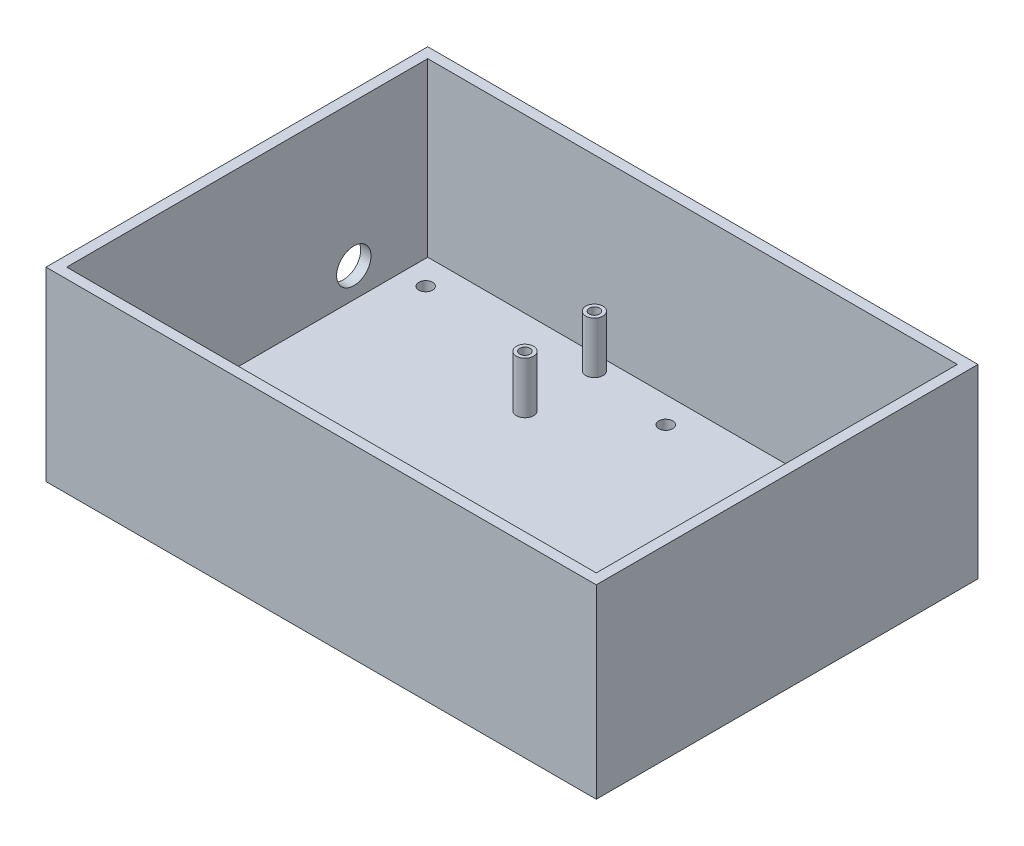
ISO-10303-21;
HEADER;
FILE_DESCRIPTION(('STEP AP214'),'2;1');
FILE_NAME('part.step','',(''),(''),'','','');
FILE_SCHEMA(('AUTOMOTIVE_DESIGN { 1 0 10303 214 1 1 1 1 }'));
ENDSEC;
DATA;
#1=APPLICATION_CONTEXT('core data for automotive mechanical design processes');
#2=APPLICATION_PROTOCOL_DEFINITION('international standard','automotive_design',2000,#1);
#3=PRODUCT_CONTEXT('',#1,'mechanical');
#4=PRODUCT('Part','Part','',(#3));
#5=PRODUCT_RELATED_PRODUCT_CATEGORY('part','',(#4));
#6=PRODUCT_DEFINITION_FORMATION('','',#4);
#7=PRODUCT_DEFINITION_CONTEXT('part definition',#1,'design');
#8=PRODUCT_DEFINITION('design','',#6,#7);
#9=PRODUCT_DEFINITION_SHAPE('','',#8);
#10=(LENGTH_UNIT() NAMED_UNIT(*) SI_UNIT(.MILLI.,.METRE.));
#11=(NAMED_UNIT(*) PLANE_ANGLE_UNIT() SI_UNIT($,.RADIAN.));
#12=(NAMED_UNIT(*) SI_UNIT($,.STERADIAN.) SOLID_ANGLE_UNIT());
#13=UNCERTAINTY_MEASURE_WITH_UNIT(LENGTH_MEASURE(1.E-05),#10,'distance_accuracy_value','');
#14=(GEOMETRIC_REPRESENTATION_CONTEXT(3) GLOBAL_UNCERTAINTY_ASSIGNED_CONTEXT((#13)) GLOBAL_UNIT_ASSIGNED_CONTEXT((#10,
#11,#12)) REPRESENTATION_CONTEXT('',''));
#15=CARTESIAN_POINT('',(0.,0.,0.));
#16=DIRECTION('',(0.,0.,1.));
#17=DIRECTION('',(1.,0.,0.));
#18=AXIS2_PLACEMENT_3D('',#15,#16,#17);
#19=CARTESIAN_POINT('',(0.,4.,0.));
#20=DIRECTION('',(0.,1.,0.));
#21=DIRECTION('',(0.,0.,1.));
#22=AXIS2_PLACEMENT_3D('',#19,#20,#21);
#23=PLANE('',#22);
#24=CARTESIAN_POINT('',(-26.1245647969052,4.,-48.16));
#25=DIRECTION('',(0.,1.,0.));
#26=DIRECTION('',(0.,0.,1.));
#27=AXIS2_PLACEMENT_3D('',#24,#25,#26);
#28=CIRCLE('',#27,2.5);
#29=CARTESIAN_POINT('',(-26.1245647969052,4.,-45.66));
#30=VERTEX_POINT('',#29);
#31=EDGE_CURVE('E155',#30,#30,#28,.T.);
#32=ORIENTED_EDGE('',*,*,#31,.F.);
#33=EDGE_LOOP('',(#32));
#34=FACE_BOUND('',#33,.T.);
#35=CARTESIAN_POINT('',(-2.12456479690523,4.,-44.9));
#36=DIRECTION('',(0.,1.,0.));
#37=DIRECTION('',(0.,0.,1.));
#38=AXIS2_PLACEMENT_3D('',#35,#36,#37);
#39=CIRCLE('',#38,2.);
#40=CARTESIAN_POINT('',(-2.12456479690523,4.,-42.9));
#41=VERTEX_POINT('',#40);
#42=EDGE_CURVE('E174',#41,#41,#39,.T.);
#43=ORIENTED_EDGE('',*,*,#42,.F.);
#44=EDGE_LOOP('',(#43));
#45=FACE_BOUND('',#44,.T.);
#46=CARTESIAN_POINT('',(-71.9245647969052,4.,-44.9));
#47=DIRECTION('',(0.,1.,0.));
#48=DIRECTION('',(0.,0.,1.));
#49=AXIS2_PLACEMENT_3D('',#46,#47,#48);
#50=CIRCLE('',#49,2.);
#51=CARTESIAN_POINT('',(-71.9245647969052,4.,-42.9));
#52=VERTEX_POINT('',#51);
#53=EDGE_CURVE('E186',#52,#52,#50,.T.);
#54=ORIENTED_EDGE('',*,*,#53,.F.);
#55=EDGE_LOOP('',(#54));
#56=FACE_BOUND('',#55,.T.);
#57=CARTESIAN_POINT('',(-71.9245647969052,4.,44.9));
#58=DIRECTION('',(0.,1.,0.));
#59=DIRECTION('',(0.,0.,-1.));
#60=AXIS2_PLACEMENT_3D('',#57,#58,#59);
#61=CIRCLE('',#60,2.);
#62=CARTESIAN_POINT('',(-71.9245647969052,4.,42.9));
#63=VERTEX_POINT('',#62);
#64=EDGE_CURVE('E180',#63,#63,#61,.T.);
#65=ORIENTED_EDGE('',*,*,#64,.F.);
#66=EDGE_LOOP('',(#65));
#67=FACE_BOUND('',#66,.T.);
#68=CARTESIAN_POINT('',(-2.12456479690523,4.,44.9));
#69=DIRECTION('',(0.,1.,0.));
#70=DIRECTION('',(0.,0.,-1.));
#71=AXIS2_PLACEMENT_3D('',#68,#69,#70);
#72=CIRCLE('',#71,2.);
#73=CARTESIAN_POINT('',(-2.12456479690523,4.,42.9));
#74=VERTEX_POINT('',#73);
#75=EDGE_CURVE('E168',#74,#74,#72,.T.);
#76=ORIENTED_EDGE('',*,*,#75,.F.);
#77=EDGE_LOOP('',(#76));
#78=FACE_BOUND('',#77,.T.);
#79=DIRECTION('',(1.,0.,0.));
#80=VECTOR('',#79,1.);
#81=CARTESIAN_POINT('',(-78.9245647969052,4.,52.5));
#82=LINE('',#81,#80);
#83=CARTESIAN_POINT('',(-78.9245647969052,4.,52.5));
#84=VERTEX_POINT('',#83);
#85=CARTESIAN_POINT('',(75.0754352030948,4.,52.5));
#86=VERTEX_POINT('',#85);
#87=EDGE_CURVE('E53',#84,#86,#82,.T.);
#88=ORIENTED_EDGE('',*,*,#87,.T.);
#89=DIRECTION('',(0.,0.,-1.));
#90=VECTOR('',#89,1.);
#91=CARTESIAN_POINT('',(75.0754352030948,4.,52.5));
#92=LINE('',#91,#90);
#93=CARTESIAN_POINT('',(75.0754352030948,4.,-52.5));
#94=VERTEX_POINT('',#93);
#95=EDGE_CURVE('E57',#86,#94,#92,.T.);
#96=ORIENTED_EDGE('',*,*,#95,.T.);
#97=DIRECTION('',(-1.,0.,0.));
#98=VECTOR('',#97,1.);
#99=CARTESIAN_POINT('',(75.0754352030948,4.,-52.5));
#100=LINE('',#99,#98);
#101=CARTESIAN_POINT('',(-78.9245647969052,4.,-52.5));
#102=VERTEX_POINT('',#101);
#103=EDGE_CURVE('E133',#94,#102,#100,.T.);
#104=ORIENTED_EDGE('',*,*,#103,.T.);
#105=DIRECTION('',(0.,0.,1.));
#106=VECTOR('',#105,1.);
#107=CARTESIAN_POINT('',(-78.9245647969052,4.,-52.5));
#108=LINE('',#107,#106);
#109=EDGE_CURVE('E112',#102,#84,#108,.T.);
#110=ORIENTED_EDGE('',*,*,#109,.T.);
#111=EDGE_LOOP('',(#88,#96,#104,#110));
#112=FACE_BOUND('',#111,.T.);
#113=CARTESIAN_POINT('',(-26.1245647969052,4.,-27.96));
#114=DIRECTION('',(0.,1.,0.));
#115=DIRECTION('',(0.,0.,1.));
#116=AXIS2_PLACEMENT_3D('',#113,#114,#115);
#117=CIRCLE('',#116,2.5);
#118=CARTESIAN_POINT('',(-26.1245647969052,4.,-25.46));
#119=VERTEX_POINT('',#118);
#120=EDGE_CURVE('E280',#119,#119,#117,.T.);
#121=ORIENTED_EDGE('',*,*,#120,.F.);
#122=EDGE_LOOP('',(#121));
#123=FACE_BOUND('',#122,.T.);
#124=ADVANCED_FACE('F37',(#34,#45,#56,#67,#78,#112,#123),#23,.T.);
#125=CARTESIAN_POINT('',(0.,0.,0.));
#126=DIRECTION('',(0.,1.,0.));
#127=DIRECTION('',(0.,0.,1.));
#128=AXIS2_PLACEMENT_3D('',#125,#126,#127);
#129=PLANE('',#128);
#130=DIRECTION('',(0.,0.,-1.));
#131=VECTOR('',#130,1.);
#132=CARTESIAN_POINT('',(78.0754352030948,0.,-55.5));
#133=LINE('',#132,#131);
#134=CARTESIAN_POINT('',(78.0754352030948,0.,55.5));
#135=VERTEX_POINT('',#134);
#136=CARTESIAN_POINT('',(78.0754352030948,0.,-55.5));
#137=VERTEX_POINT('',#136);
#138=EDGE_CURVE('E189',#135,#137,#133,.T.);
#139=ORIENTED_EDGE('',*,*,#138,.F.);
#140=DIRECTION('',(1.,0.,0.));
#141=VECTOR('',#140,1.);
#142=CARTESIAN_POINT('',(-81.9245647969052,0.,55.5));
#143=LINE('',#142,#141);
#144=CARTESIAN_POINT('',(-81.9245647969052,0.,55.5));
#145=VERTEX_POINT('',#144);
#146=EDGE_CURVE('E198',#145,#135,#143,.T.);
#147=ORIENTED_EDGE('',*,*,#146,.F.);
#148=DIRECTION('',(0.,0.,1.));
#149=VECTOR('',#148,1.);
#150=CARTESIAN_POINT('',(-81.9245647969052,0.,-55.5));
#151=LINE('',#150,#149);
#152=CARTESIAN_POINT('',(-81.9245647969052,0.,-55.5));
#153=VERTEX_POINT('',#152);
#154=EDGE_CURVE('E196',#153,#145,#151,.T.);
#155=ORIENTED_EDGE('',*,*,#154,.F.);
#156=DIRECTION('',(-1.,0.,0.));
#157=VECTOR('',#156,1.);
#158=CARTESIAN_POINT('',(-81.9245647969052,0.,-55.5));
#159=LINE('',#158,#157);
#160=EDGE_CURVE('E194',#137,#153,#159,.T.);
#161=ORIENTED_EDGE('',*,*,#160,.F.);
#162=EDGE_LOOP('',(#139,#147,#155,#161));
#163=FACE_BOUND('',#162,.T.);
#164=CARTESIAN_POINT('',(-71.9245647969052,0.,-44.9));
#165=DIRECTION('',(0.,1.,0.));
#166=DIRECTION('',(0.,0.,1.));
#167=AXIS2_PLACEMENT_3D('',#164,#165,#166);
#168=CIRCLE('',#167,2.);
#169=CARTESIAN_POINT('',(-71.9245647969052,0.,-42.9));
#170=VERTEX_POINT('',#169);
#171=EDGE_CURVE('E183',#170,#170,#168,.T.);
#172=ORIENTED_EDGE('',*,*,#171,.T.);
#173=EDGE_LOOP('',(#172));
#174=FACE_BOUND('',#173,.T.);
#175=CARTESIAN_POINT('',(-71.9245647969052,0.,44.9));
#176=DIRECTION('',(0.,1.,0.));
#177=DIRECTION('',(0.,0.,-1.));
#178=AXIS2_PLACEMENT_3D('',#175,#176,#177);
#179=CIRCLE('',#178,2.);
#180=CARTESIAN_POINT('',(-71.9245647969052,0.,42.9));
#181=VERTEX_POINT('',#180);
#182=EDGE_CURVE('E177',#181,#181,#179,.T.);
#183=ORIENTED_EDGE('',*,*,#182,.T.);
#184=EDGE_LOOP('',(#183));
#185=FACE_BOUND('',#184,.T.);
#186=CARTESIAN_POINT('',(-2.12456479690523,0.,-44.9));
#187=DIRECTION('',(0.,1.,0.));
#188=DIRECTION('',(0.,0.,1.));
#189=AXIS2_PLACEMENT_3D('',#186,#187,#188);
#190=CIRCLE('',#189,2.);
#191=CARTESIAN_POINT('',(-2.12456479690523,0.,-42.9));
#192=VERTEX_POINT('',#191);
#193=EDGE_CURVE('E171',#192,#192,#190,.T.);
#194=ORIENTED_EDGE('',*,*,#193,.T.);
#195=EDGE_LOOP('',(#194));
#196=FACE_BOUND('',#195,.T.);
#197=CARTESIAN_POINT('',(-2.12456479690523,0.,44.9));
#198=DIRECTION('',(0.,1.,0.));
#199=DIRECTION('',(0.,0.,-1.));
#200=AXIS2_PLACEMENT_3D('',#197,#198,#199);
#201=CIRCLE('',#200,2.);
#202=CARTESIAN_POINT('',(-2.12456479690523,0.,42.9));
#203=VERTEX_POINT('',#202);
#204=EDGE_CURVE('E167',#203,#203,#201,.T.);
#205=ORIENTED_EDGE('',*,*,#204,.T.);
#206=EDGE_LOOP('',(#205));
#207=FACE_BOUND('',#206,.T.);
#208=CARTESIAN_POINT('',(-26.1245647969052,0.,-48.16));
#209=DIRECTION('',(0.,1.,0.));
#210=DIRECTION('',(0.,0.,1.));
#211=AXIS2_PLACEMENT_3D('',#208,#209,#210);
#212=CIRCLE('',#211,1.5);
#213=CARTESIAN_POINT('',(-26.1245647969052,0.,-46.66));
#214=VERTEX_POINT('',#213);
#215=EDGE_CURVE('E164',#214,#214,#212,.T.);
#216=ORIENTED_EDGE('',*,*,#215,.T.);
#217=EDGE_LOOP('',(#216));
#218=FACE_BOUND('',#217,.T.);
#219=CARTESIAN_POINT('',(-26.1245647969052,0.,-27.96));
#220=DIRECTION('',(0.,1.,0.));
#221=DIRECTION('',(0.,0.,1.));
#222=AXIS2_PLACEMENT_3D('',#219,#220,#221);
#223=CIRCLE('',#222,1.5);
#224=CARTESIAN_POINT('',(-26.1245647969052,0.,-26.46));
#225=VERTEX_POINT('',#224);
#226=EDGE_CURVE('E159',#225,#225,#223,.T.);
#227=ORIENTED_EDGE('',*,*,#226,.T.);
#228=EDGE_LOOP('',(#227));
#229=FACE_BOUND('',#228,.T.);
#230=ADVANCED_FACE('F216',(#163,#174,#185,#196,#207,#218,#229),#129,.F.);
#231=CARTESIAN_POINT('',(78.0754352030948,4.,-55.5));
#232=DIRECTION('',(-1.,0.,0.));
#233=DIRECTION('',(0.,0.,1.));
#234=AXIS2_PLACEMENT_3D('',#231,#232,#233);
#235=PLANE('',#234);
#236=ORIENTED_EDGE('',*,*,#138,.T.);
#237=DIRECTION('',(0.,-1.,0.));
#238=VECTOR('',#237,1.);
#239=CARTESIAN_POINT('',(78.0754352030948,4.,-55.5));
#240=LINE('',#239,#238);
#241=CARTESIAN_POINT('',(78.0754352030948,54.,-55.5));
#242=VERTEX_POINT('',#241);
#243=EDGE_CURVE('E11',#242,#137,#240,.T.);
#244=ORIENTED_EDGE('',*,*,#243,.F.);
#245=DIRECTION('',(0.,0.,-1.));
#246=VECTOR('',#245,1.);
#247=CARTESIAN_POINT('',(78.0754352030948,54.,55.5));
#248=LINE('',#247,#246);
#249=CARTESIAN_POINT('',(78.0754352030948,54.,55.5));
#250=VERTEX_POINT('',#249);
#251=EDGE_CURVE('E117',#250,#242,#248,.T.);
#252=ORIENTED_EDGE('',*,*,#251,.F.);
#253=DIRECTION('',(0.,-1.,0.));
#254=VECTOR('',#253,1.);
#255=CARTESIAN_POINT('',(78.0754352030948,4.,55.5));
#256=LINE('',#255,#254);
#257=EDGE_CURVE('E200',#250,#135,#256,.T.);
#258=ORIENTED_EDGE('',*,*,#257,.T.);
#259=EDGE_LOOP('',(#236,#244,#252,#258));
#260=FACE_BOUND('',#259,.T.);
#261=ADVANCED_FACE('F39',(#260),#235,.F.);
#262=CARTESIAN_POINT('',(-81.9245647969052,4.,-55.5));
#263=DIRECTION('',(0.,0.,1.));
#264=DIRECTION('',(1.,0.,0.));
#265=AXIS2_PLACEMENT_3D('',#262,#263,#264);
#266=PLANE('',#265);
#267=ORIENTED_EDGE('',*,*,#160,.T.);
#268=DIRECTION('',(0.,-1.,0.));
#269=VECTOR('',#268,1.);
#270=CARTESIAN_POINT('',(-81.9245647969052,4.,-55.5));
#271=LINE('',#270,#269);
#272=CARTESIAN_POINT('',(-81.9245647969052,54.,-55.5));
#273=VERTEX_POINT('',#272);
#274=EDGE_CURVE('E46',#273,#153,#271,.T.);
#275=ORIENTED_EDGE('',*,*,#274,.F.);
#276=DIRECTION('',(-1.,0.,0.));
#277=VECTOR('',#276,1.);
#278=CARTESIAN_POINT('',(78.0754352030948,54.,-55.5));
#279=LINE('',#278,#277);
#280=EDGE_CURVE('E143',#242,#273,#279,.T.);
#281=ORIENTED_EDGE('',*,*,#280,.F.);
#282=ORIENTED_EDGE('',*,*,#243,.T.);
#283=EDGE_LOOP('',(#267,#275,#281,#282));
#284=FACE_BOUND('',#283,.T.);
#285=ADVANCED_FACE('F224',(#284),#266,.F.);
#286=CARTESIAN_POINT('',(-81.9245647969052,4.,-55.5));
#287=DIRECTION('',(1.,0.,0.));
#288=DIRECTION('',(0.,0.,-1.));
#289=AXIS2_PLACEMENT_3D('',#286,#287,#288);
#290=PLANE('',#289);
#291=CARTESIAN_POINT('',(-81.9245647969052,12.58,-31.));
#292=DIRECTION('',(-1.,0.,0.));
#293=DIRECTION('',(0.,0.,1.));
#294=AXIS2_PLACEMENT_3D('',#291,#292,#293);
#295=CIRCLE('',#294,5.);
#296=CARTESIAN_POINT('',(-81.9245647969052,12.58,-26.));
#297=VERTEX_POINT('',#296);
#298=EDGE_CURVE('E284',#297,#297,#295,.T.);
#299=ORIENTED_EDGE('',*,*,#298,.F.);
#300=EDGE_LOOP('',(#299));
#301=FACE_BOUND('',#300,.T.);
#302=ORIENTED_EDGE('',*,*,#154,.T.);
#303=DIRECTION('',(0.,-1.,0.));
#304=VECTOR('',#303,1.);
#305=CARTESIAN_POINT('',(-81.9245647969052,4.,55.5));
#306=LINE('',#305,#304);
#307=CARTESIAN_POINT('',(-81.9245647969052,54.,55.5));
#308=VERTEX_POINT('',#307);
#309=EDGE_CURVE('E203',#308,#145,#306,.T.);
#310=ORIENTED_EDGE('',*,*,#309,.F.);
#311=DIRECTION('',(0.,0.,1.));
#312=VECTOR('',#311,1.);
#313=CARTESIAN_POINT('',(-81.9245647969052,54.,-55.5));
#314=LINE('',#313,#312);
#315=EDGE_CURVE('E146',#273,#308,#314,.T.);
#316=ORIENTED_EDGE('',*,*,#315,.F.);
#317=ORIENTED_EDGE('',*,*,#274,.T.);
#318=EDGE_LOOP('',(#302,#310,#316,#317));
#319=FACE_BOUND('',#318,.T.);
#320=ADVANCED_FACE('F210',(#301,#319),#290,.F.);
#321=CARTESIAN_POINT('',(-81.9245647969052,4.,55.5));
#322=DIRECTION('',(0.,0.,-1.));
#323=DIRECTION('',(-1.,0.,0.));
#324=AXIS2_PLACEMENT_3D('',#321,#322,#323);
#325=PLANE('',#324);
#326=ORIENTED_EDGE('',*,*,#146,.T.);
#327=ORIENTED_EDGE('',*,*,#257,.F.);
#328=DIRECTION('',(1.,0.,0.));
#329=VECTOR('',#328,1.);
#330=CARTESIAN_POINT('',(-81.9245647969052,54.,55.5));
#331=LINE('',#330,#329);
#332=EDGE_CURVE('E149',#308,#250,#331,.T.);
#333=ORIENTED_EDGE('',*,*,#332,.F.);
#334=ORIENTED_EDGE('',*,*,#309,.T.);
#335=EDGE_LOOP('',(#326,#327,#333,#334));
#336=FACE_BOUND('',#335,.T.);
#337=ADVANCED_FACE('F219',(#336),#325,.F.);
#338=CARTESIAN_POINT('',(-71.9245647969052,4.,-44.9));
#339=DIRECTION('',(0.,-1.,0.));
#340=DIRECTION('',(0.,0.,-1.));
#341=AXIS2_PLACEMENT_3D('',#338,#339,#340);
#342=CYLINDRICAL_SURFACE('',#341,2.);
#343=ORIENTED_EDGE('',*,*,#53,.T.);
#344=EDGE_LOOP('',(#343));
#345=FACE_BOUND('',#344,.T.);
#346=ORIENTED_EDGE('',*,*,#171,.F.);
#347=EDGE_LOOP('',(#346));
#348=FACE_BOUND('',#347,.T.);
#349=ADVANCED_FACE('F242',(#345,#348),#342,.F.);
#350=CARTESIAN_POINT('',(-71.9245647969052,4.,44.9));
#351=DIRECTION('',(0.,-1.,0.));
#352=DIRECTION('',(0.,0.,-1.));
#353=AXIS2_PLACEMENT_3D('',#350,#351,#352);
#354=CYLINDRICAL_SURFACE('',#353,2.);
#355=ORIENTED_EDGE('',*,*,#64,.T.);
#356=EDGE_LOOP('',(#355));
#357=FACE_BOUND('',#356,.T.);
#358=ORIENTED_EDGE('',*,*,#182,.F.);
#359=EDGE_LOOP('',(#358));
#360=FACE_BOUND('',#359,.T.);
#361=ADVANCED_FACE('F249',(#357,#360),#354,.F.);
#362=CARTESIAN_POINT('',(-2.12456479690523,4.,-44.9));
#363=DIRECTION('',(0.,-1.,0.));
#364=DIRECTION('',(0.,0.,-1.));
#365=AXIS2_PLACEMENT_3D('',#362,#363,#364);
#366=CYLINDRICAL_SURFACE('',#365,2.);
#367=ORIENTED_EDGE('',*,*,#42,.T.);
#368=EDGE_LOOP('',(#367));
#369=FACE_BOUND('',#368,.T.);
#370=ORIENTED_EDGE('',*,*,#193,.F.);
#371=EDGE_LOOP('',(#370));
#372=FACE_BOUND('',#371,.T.);
#373=ADVANCED_FACE('F254',(#369,#372),#366,.F.);
#374=CARTESIAN_POINT('',(-2.12456479690523,4.,44.9));
#375=DIRECTION('',(0.,-1.,0.));
#376=DIRECTION('',(0.,0.,-1.));
#377=AXIS2_PLACEMENT_3D('',#374,#375,#376);
#378=CYLINDRICAL_SURFACE('',#377,2.);
#379=ORIENTED_EDGE('',*,*,#75,.T.);
#380=EDGE_LOOP('',(#379));
#381=FACE_BOUND('',#380,.T.);
#382=ORIENTED_EDGE('',*,*,#204,.F.);
#383=EDGE_LOOP('',(#382));
#384=FACE_BOUND('',#383,.T.);
#385=ADVANCED_FACE('F330',(#381,#384),#378,.F.);
#386=CARTESIAN_POINT('',(-26.1245647969052,4.,-48.16));
#387=DIRECTION('',(0.,-1.,0.));
#388=DIRECTION('',(0.,0.,-1.));
#389=AXIS2_PLACEMENT_3D('',#386,#387,#388);
#390=CYLINDRICAL_SURFACE('',#389,1.5);
#391=ORIENTED_EDGE('',*,*,#215,.F.);
#392=EDGE_LOOP('',(#391));
#393=FACE_BOUND('',#392,.T.);
#394=CARTESIAN_POINT('',(-26.1245647969052,19.,-48.16));
#395=DIRECTION('',(0.,1.,0.));
#396=DIRECTION('',(0.,0.,1.));
#397=AXIS2_PLACEMENT_3D('',#394,#395,#396);
#398=CIRCLE('',#397,1.5);
#399=CARTESIAN_POINT('',(-26.1245647969052,19.,-46.66));
#400=VERTEX_POINT('',#399);
#401=EDGE_CURVE('E152',#400,#400,#398,.T.);
#402=ORIENTED_EDGE('',*,*,#401,.T.);
#403=EDGE_LOOP('',(#402));
#404=FACE_BOUND('',#403,.T.);
#405=ADVANCED_FACE('F274',(#393,#404),#390,.F.);
#406=CARTESIAN_POINT('',(-26.1245647969052,4.,-27.96));
#407=DIRECTION('',(0.,-1.,0.));
#408=DIRECTION('',(0.,0.,-1.));
#409=AXIS2_PLACEMENT_3D('',#406,#407,#408);
#410=CYLINDRICAL_SURFACE('',#409,1.5);
#411=ORIENTED_EDGE('',*,*,#226,.F.);
#412=EDGE_LOOP('',(#411));
#413=FACE_BOUND('',#412,.T.);
#414=CARTESIAN_POINT('',(-26.1245647969052,19.,-27.96));
#415=DIRECTION('',(0.,1.,0.));
#416=DIRECTION('',(0.,0.,1.));
#417=AXIS2_PLACEMENT_3D('',#414,#415,#416);
#418=CIRCLE('',#417,1.5);
#419=CARTESIAN_POINT('',(-26.1245647969052,19.,-26.46));
#420=VERTEX_POINT('',#419);
#421=EDGE_CURVE('E278',#420,#420,#418,.T.);
#422=ORIENTED_EDGE('',*,*,#421,.T.);
#423=EDGE_LOOP('',(#422));
#424=FACE_BOUND('',#423,.T.);
#425=ADVANCED_FACE('F270',(#413,#424),#410,.F.);
#426=CARTESIAN_POINT('',(-26.1245647969052,19.,-48.16));
#427=DIRECTION('',(0.,1.,0.));
#428=DIRECTION('',(0.,0.,1.));
#429=AXIS2_PLACEMENT_3D('',#426,#427,#428);
#430=PLANE('',#429);
#431=CARTESIAN_POINT('',(-26.1245647969052,19.,-48.16));
#432=DIRECTION('',(0.,1.,0.));
#433=DIRECTION('',(0.,0.,1.));
#434=AXIS2_PLACEMENT_3D('',#431,#432,#433);
#435=CIRCLE('',#434,2.5);
#436=CARTESIAN_POINT('',(-26.1245647969052,19.,-45.66));
#437=VERTEX_POINT('',#436);
#438=EDGE_CURVE('E156',#437,#437,#435,.T.);
#439=ORIENTED_EDGE('',*,*,#438,.T.);
#440=EDGE_LOOP('',(#439));
#441=FACE_BOUND('',#440,.T.);
#442=ORIENTED_EDGE('',*,*,#401,.F.);
#443=EDGE_LOOP('',(#442));
#444=FACE_BOUND('',#443,.T.);
#445=ADVANCED_FACE('F273',(#441,#444),#430,.T.);
#446=CARTESIAN_POINT('',(-26.1245647969052,19.,-48.16));
#447=DIRECTION('',(0.,-1.,0.));
#448=DIRECTION('',(0.,0.,-1.));
#449=AXIS2_PLACEMENT_3D('',#446,#447,#448);
#450=CYLINDRICAL_SURFACE('',#449,2.5);
#451=ORIENTED_EDGE('',*,*,#438,.F.);
#452=EDGE_LOOP('',(#451));
#453=FACE_BOUND('',#452,.T.);
#454=ORIENTED_EDGE('',*,*,#31,.T.);
#455=EDGE_LOOP('',(#454));
#456=FACE_BOUND('',#455,.T.);
#457=ADVANCED_FACE('F321',(#453,#456),#450,.T.);
#458=CARTESIAN_POINT('',(0.,54.,0.));
#459=DIRECTION('',(0.,1.,0.));
#460=DIRECTION('',(0.,0.,1.));
#461=AXIS2_PLACEMENT_3D('',#458,#459,#460);
#462=PLANE('',#461);
#463=ORIENTED_EDGE('',*,*,#251,.T.);
#464=ORIENTED_EDGE('',*,*,#280,.T.);
#465=ORIENTED_EDGE('',*,*,#315,.T.);
#466=ORIENTED_EDGE('',*,*,#332,.T.);
#467=EDGE_LOOP('',(#463,#464,#465,#466));
#468=FACE_BOUND('',#467,.T.);
#469=DIRECTION('',(0.,0.,-1.));
#470=VECTOR('',#469,1.);
#471=CARTESIAN_POINT('',(75.0754352030948,54.,52.5));
#472=LINE('',#471,#470);
#473=CARTESIAN_POINT('',(75.0754352030948,54.,52.5));
#474=VERTEX_POINT('',#473);
#475=CARTESIAN_POINT('',(75.0754352030948,54.,-52.5));
#476=VERTEX_POINT('',#475);
#477=EDGE_CURVE('E111',#474,#476,#472,.T.);
#478=ORIENTED_EDGE('',*,*,#477,.F.);
#479=DIRECTION('',(1.,0.,0.));
#480=VECTOR('',#479,1.);
#481=CARTESIAN_POINT('',(-78.9245647969052,54.,52.5));
#482=LINE('',#481,#480);
#483=CARTESIAN_POINT('',(-78.9245647969052,54.,52.5));
#484=VERTEX_POINT('',#483);
#485=EDGE_CURVE('E102',#484,#474,#482,.T.);
#486=ORIENTED_EDGE('',*,*,#485,.F.);
#487=DIRECTION('',(0.,0.,1.));
#488=VECTOR('',#487,1.);
#489=CARTESIAN_POINT('',(-78.9245647969052,54.,-52.5));
#490=LINE('',#489,#488);
#491=CARTESIAN_POINT('',(-78.9245647969052,54.,-52.5));
#492=VERTEX_POINT('',#491);
#493=EDGE_CURVE('E125',#492,#484,#490,.T.);
#494=ORIENTED_EDGE('',*,*,#493,.F.);
#495=DIRECTION('',(-1.,0.,0.));
#496=VECTOR('',#495,1.);
#497=CARTESIAN_POINT('',(75.0754352030948,54.,-52.5));
#498=LINE('',#497,#496);
#499=EDGE_CURVE('E123',#476,#492,#498,.T.);
#500=ORIENTED_EDGE('',*,*,#499,.F.);
#501=EDGE_LOOP('',(#478,#486,#494,#500));
#502=FACE_BOUND('',#501,.T.);
#503=ADVANCED_FACE('F121',(#468,#502),#462,.T.);
#504=CARTESIAN_POINT('',(-78.9245647969052,54.,52.5));
#505=DIRECTION('',(0.,0.,-1.));
#506=DIRECTION('',(-1.,0.,0.));
#507=AXIS2_PLACEMENT_3D('',#504,#505,#506);
#508=PLANE('',#507);
#509=ORIENTED_EDGE('',*,*,#87,.F.);
#510=DIRECTION('',(0.,-1.,0.));
#511=VECTOR('',#510,1.);
#512=CARTESIAN_POINT('',(-78.9245647969052,54.,52.5));
#513=LINE('',#512,#511);
#514=EDGE_CURVE('E107',#484,#84,#513,.T.);
#515=ORIENTED_EDGE('',*,*,#514,.F.);
#516=ORIENTED_EDGE('',*,*,#485,.T.);
#517=DIRECTION('',(0.,-1.,0.));
#518=VECTOR('',#517,1.);
#519=CARTESIAN_POINT('',(75.0754352030948,54.,52.5));
#520=LINE('',#519,#518);
#521=EDGE_CURVE('E105',#474,#86,#520,.T.);
#522=ORIENTED_EDGE('',*,*,#521,.T.);
#523=EDGE_LOOP('',(#509,#515,#516,#522));
#524=FACE_BOUND('',#523,.T.);
#525=ADVANCED_FACE('F104',(#524),#508,.T.);
#526=CARTESIAN_POINT('',(75.0754352030948,54.,52.5));
#527=DIRECTION('',(-1.,0.,0.));
#528=DIRECTION('',(0.,0.,1.));
#529=AXIS2_PLACEMENT_3D('',#526,#527,#528);
#530=PLANE('',#529);
#531=ORIENTED_EDGE('',*,*,#95,.F.);
#532=ORIENTED_EDGE('',*,*,#521,.F.);
#533=ORIENTED_EDGE('',*,*,#477,.T.);
#534=DIRECTION('',(0.,-1.,0.));
#535=VECTOR('',#534,1.);
#536=CARTESIAN_POINT('',(75.0754352030948,54.,-52.5));
#537=LINE('',#536,#535);
#538=EDGE_CURVE('E118',#476,#94,#537,.T.);
#539=ORIENTED_EDGE('',*,*,#538,.T.);
#540=EDGE_LOOP('',(#531,#532,#533,#539));
#541=FACE_BOUND('',#540,.T.);
#542=ADVANCED_FACE('F115',(#541),#530,.T.);
#543=CARTESIAN_POINT('',(75.0754352030948,54.,-52.5));
#544=DIRECTION('',(0.,0.,1.));
#545=DIRECTION('',(1.,0.,0.));
#546=AXIS2_PLACEMENT_3D('',#543,#544,#545);
#547=PLANE('',#546);
#548=ORIENTED_EDGE('',*,*,#103,.F.);
#549=ORIENTED_EDGE('',*,*,#538,.F.);
#550=ORIENTED_EDGE('',*,*,#499,.T.);
#551=DIRECTION('',(0.,-1.,0.));
#552=VECTOR('',#551,1.);
#553=CARTESIAN_POINT('',(-78.9245647969052,54.,-52.5));
#554=LINE('',#553,#552);
#555=EDGE_CURVE('E137',#492,#102,#554,.T.);
#556=ORIENTED_EDGE('',*,*,#555,.T.);
#557=EDGE_LOOP('',(#548,#549,#550,#556));
#558=FACE_BOUND('',#557,.T.);
#559=ADVANCED_FACE('F310',(#558),#547,.T.);
#560=CARTESIAN_POINT('',(-78.9245647969052,54.,-52.5));
#561=DIRECTION('',(1.,0.,0.));
#562=DIRECTION('',(0.,0.,-1.));
#563=AXIS2_PLACEMENT_3D('',#560,#561,#562);
#564=PLANE('',#563);
#565=CARTESIAN_POINT('',(-78.9245647969052,12.58,-31.));
#566=DIRECTION('',(1.,0.,0.));
#567=DIRECTION('',(0.,0.,-1.));
#568=AXIS2_PLACEMENT_3D('',#565,#566,#567);
#569=CIRCLE('',#568,5.);
#570=CARTESIAN_POINT('',(-78.9245647969052,12.58,-36.));
#571=VERTEX_POINT('',#570);
#572=EDGE_CURVE('E41',#571,#571,#569,.T.);
#573=ORIENTED_EDGE('',*,*,#572,.F.);
#574=EDGE_LOOP('',(#573));
#575=FACE_BOUND('',#574,.T.);
#576=ORIENTED_EDGE('',*,*,#109,.F.);
#577=ORIENTED_EDGE('',*,*,#555,.F.);
#578=ORIENTED_EDGE('',*,*,#493,.T.);
#579=ORIENTED_EDGE('',*,*,#514,.T.);
#580=EDGE_LOOP('',(#576,#577,#578,#579));
#581=FACE_BOUND('',#580,.T.);
#582=ADVANCED_FACE('F305',(#575,#581),#564,.T.);
#583=CARTESIAN_POINT('',(-26.1245647969052,19.,-27.96));
#584=DIRECTION('',(0.,1.,0.));
#585=DIRECTION('',(0.,0.,1.));
#586=AXIS2_PLACEMENT_3D('',#583,#584,#585);
#587=PLANE('',#586);
#588=CARTESIAN_POINT('',(-26.1245647969052,19.,-27.96));
#589=DIRECTION('',(0.,1.,0.));
#590=DIRECTION('',(0.,0.,1.));
#591=AXIS2_PLACEMENT_3D('',#588,#589,#590);
#592=CIRCLE('',#591,2.5);
#593=CARTESIAN_POINT('',(-26.1245647969052,19.,-25.46));
#594=VERTEX_POINT('',#593);
#595=EDGE_CURVE('E131',#594,#594,#592,.T.);
#596=ORIENTED_EDGE('',*,*,#595,.T.);
#597=EDGE_LOOP('',(#596));
#598=FACE_BOUND('',#597,.T.);
#599=ORIENTED_EDGE('',*,*,#421,.F.);
#600=EDGE_LOOP('',(#599));
#601=FACE_BOUND('',#600,.T.);
#602=ADVANCED_FACE('F290',(#598,#601),#587,.T.);
#603=CARTESIAN_POINT('',(-26.1245647969052,19.,-27.96));
#604=DIRECTION('',(0.,-1.,0.));
#605=DIRECTION('',(0.,0.,-1.));
#606=AXIS2_PLACEMENT_3D('',#603,#604,#605);
#607=CYLINDRICAL_SURFACE('',#606,2.5);
#608=ORIENTED_EDGE('',*,*,#595,.F.);
#609=EDGE_LOOP('',(#608));
#610=FACE_BOUND('',#609,.T.);
#611=ORIENTED_EDGE('',*,*,#120,.T.);
#612=EDGE_LOOP('',(#611));
#613=FACE_BOUND('',#612,.T.);
#614=ADVANCED_FACE('F292',(#610,#613),#607,.T.);
#615=CARTESIAN_POINT('',(-76.9245647969052,12.58,-31.));
#616=DIRECTION('',(-1.,0.,0.));
#617=DIRECTION('',(0.,0.,1.));
#618=AXIS2_PLACEMENT_3D('',#615,#616,#617);
#619=CYLINDRICAL_SURFACE('',#618,5.);
#620=ORIENTED_EDGE('',*,*,#572,.T.);
#621=EDGE_LOOP('',(#620));
#622=FACE_BOUND('',#621,.T.);
#623=ORIENTED_EDGE('',*,*,#298,.T.);
#624=EDGE_LOOP('',(#623));
#625=FACE_BOUND('',#624,.T.);
#626=ADVANCED_FACE('F295',(#622,#625),#619,.F.);
#627=CLOSED_SHELL('',(#124,#230,#261,#285,#320,#337,#349,#361,#373,#385,#405,#425,#445,#457,
#503,#525,#542,#559,#582,#602,#614,#626));
#628=MANIFOLD_SOLID_BREP('B2',#627);
#629=ADVANCED_BREP_SHAPE_REPRESENTATION('',(#18,#628),#14);
#630=SHAPE_DEFINITION_REPRESENTATION(#9,#629);
ENDSEC;
END-ISO-10303-21;
